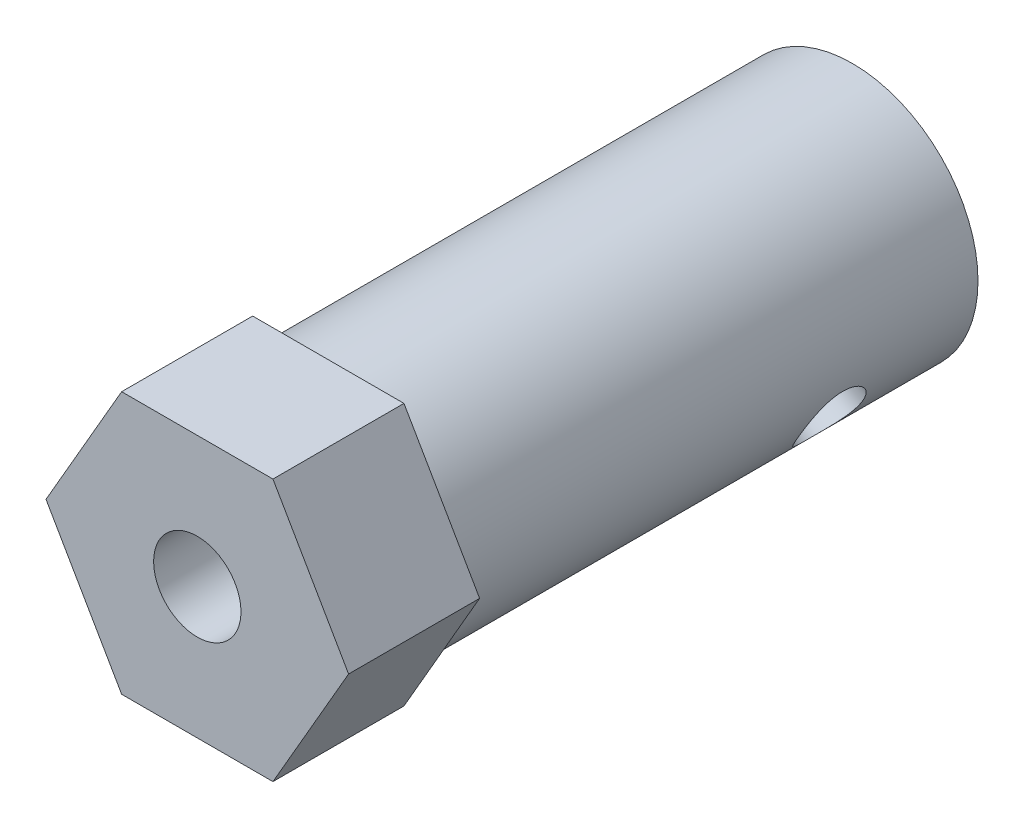
ISO-10303-21;
HEADER;
FILE_DESCRIPTION(('STEP AP214'),'2;1');
FILE_NAME('part.step','',(''),(''),'','','');
FILE_SCHEMA(('AUTOMOTIVE_DESIGN { 1 0 10303 214 1 1 1 1 }'));
ENDSEC;
DATA;
#1=APPLICATION_CONTEXT('core data for automotive mechanical design processes');
#2=APPLICATION_PROTOCOL_DEFINITION('international standard','automotive_design',2000,#1);
#3=PRODUCT_CONTEXT('',#1,'mechanical');
#4=PRODUCT('Part','Part','',(#3));
#5=PRODUCT_RELATED_PRODUCT_CATEGORY('part','',(#4));
#6=PRODUCT_DEFINITION_FORMATION('','',#4);
#7=PRODUCT_DEFINITION_CONTEXT('part definition',#1,'design');
#8=PRODUCT_DEFINITION('design','',#6,#7);
#9=PRODUCT_DEFINITION_SHAPE('','',#8);
#10=(LENGTH_UNIT() NAMED_UNIT(*) SI_UNIT(.MILLI.,.METRE.));
#11=(NAMED_UNIT(*) PLANE_ANGLE_UNIT() SI_UNIT($,.RADIAN.));
#12=(NAMED_UNIT(*) SI_UNIT($,.STERADIAN.) SOLID_ANGLE_UNIT());
#13=UNCERTAINTY_MEASURE_WITH_UNIT(LENGTH_MEASURE(1.E-05),#10,'distance_accuracy_value','');
#14=(GEOMETRIC_REPRESENTATION_CONTEXT(3) GLOBAL_UNCERTAINTY_ASSIGNED_CONTEXT((#13)) GLOBAL_UNIT_ASSIGNED_CONTEXT((#10,
#11,#12)) REPRESENTATION_CONTEXT('',''));
#15=CARTESIAN_POINT('',(0.,0.,0.));
#16=DIRECTION('',(0.,0.,1.));
#17=DIRECTION('',(1.,0.,0.));
#18=AXIS2_PLACEMENT_3D('',#15,#16,#17);
#19=CARTESIAN_POINT('',(-3.46410161513783,5.99999999999996,6.));
#20=DIRECTION('',(0.866025403784441,-0.499999999999995,0.));
#21=DIRECTION('',(0.499999999999995,0.866025403784442,0.));
#22=AXIS2_PLACEMENT_3D('',#19,#20,#21);
#23=PLANE('',#22);
#24=DIRECTION('',(-0.499999999999995,-0.866025403784441,0.));
#25=VECTOR('',#24,1.);
#26=CARTESIAN_POINT('',(-3.46410161513783,5.99999999999996,0.));
#27=LINE('',#26,#25);
#28=CARTESIAN_POINT('',(-3.46410161513783,5.99999999999996,0.));
#29=VERTEX_POINT('',#28);
#30=CARTESIAN_POINT('',(-6.92820323027551,0.,0.));
#31=VERTEX_POINT('',#30);
#32=EDGE_CURVE('E131',#29,#31,#27,.T.);
#33=ORIENTED_EDGE('',*,*,#32,.T.);
#34=DIRECTION('',(0.,0.,-1.));
#35=VECTOR('',#34,1.);
#36=CARTESIAN_POINT('',(-6.92820323027551,0.,6.));
#37=LINE('',#36,#35);
#38=CARTESIAN_POINT('',(-6.92820323027551,0.,6.));
#39=VERTEX_POINT('',#38);
#40=EDGE_CURVE('E54',#39,#31,#37,.T.);
#41=ORIENTED_EDGE('',*,*,#40,.F.);
#42=DIRECTION('',(-0.499999999999995,-0.866025403784441,0.));
#43=VECTOR('',#42,1.);
#44=CARTESIAN_POINT('',(-3.46410161513783,5.99999999999996,6.));
#45=LINE('',#44,#43);
#46=CARTESIAN_POINT('',(-3.46410161513783,5.99999999999996,6.));
#47=VERTEX_POINT('',#46);
#48=EDGE_CURVE('E145',#47,#39,#45,.T.);
#49=ORIENTED_EDGE('',*,*,#48,.F.);
#50=DIRECTION('',(0.,0.,-1.));
#51=VECTOR('',#50,1.);
#52=CARTESIAN_POINT('',(-3.46410161513783,5.99999999999996,6.));
#53=LINE('',#52,#51);
#54=EDGE_CURVE('E129',#47,#29,#53,.T.);
#55=ORIENTED_EDGE('',*,*,#54,.T.);
#56=EDGE_LOOP('',(#33,#41,#49,#55));
#57=FACE_BOUND('',#56,.T.);
#58=ADVANCED_FACE('F41',(#57),#23,.F.);
#59=CARTESIAN_POINT('',(-6.92820323027551,0.,6.));
#60=DIRECTION('',(0.866025403784438,0.500000000000001,0.));
#61=DIRECTION('',(-0.500000000000001,0.866025403784438,0.));
#62=AXIS2_PLACEMENT_3D('',#59,#60,#61);
#63=PLANE('',#62);
#64=DIRECTION('',(0.500000000000001,-0.866025403784438,0.));
#65=VECTOR('',#64,1.);
#66=CARTESIAN_POINT('',(-6.92820323027551,0.,0.));
#67=LINE('',#66,#65);
#68=CARTESIAN_POINT('',(-3.46410161513774,-6.00000000000001,0.));
#69=VERTEX_POINT('',#68);
#70=EDGE_CURVE('E138',#31,#69,#67,.T.);
#71=ORIENTED_EDGE('',*,*,#70,.T.);
#72=DIRECTION('',(0.,0.,-1.));
#73=VECTOR('',#72,1.);
#74=CARTESIAN_POINT('',(-3.46410161513774,-6.00000000000001,6.));
#75=LINE('',#74,#73);
#76=CARTESIAN_POINT('',(-3.46410161513774,-6.00000000000001,6.));
#77=VERTEX_POINT('',#76);
#78=EDGE_CURVE('E146',#77,#69,#75,.T.);
#79=ORIENTED_EDGE('',*,*,#78,.F.);
#80=DIRECTION('',(0.500000000000001,-0.866025403784438,0.));
#81=VECTOR('',#80,1.);
#82=CARTESIAN_POINT('',(-6.92820323027551,0.,6.));
#83=LINE('',#82,#81);
#84=EDGE_CURVE('E105',#39,#77,#83,.T.);
#85=ORIENTED_EDGE('',*,*,#84,.F.);
#86=ORIENTED_EDGE('',*,*,#40,.T.);
#87=EDGE_LOOP('',(#71,#79,#85,#86));
#88=FACE_BOUND('',#87,.T.);
#89=ADVANCED_FACE('F151',(#88),#63,.F.);
#90=CARTESIAN_POINT('',(-3.46410161513774,-6.00000000000001,6.));
#91=DIRECTION('',(0.,1.,0.));
#92=DIRECTION('',(-1.,0.,0.));
#93=AXIS2_PLACEMENT_3D('',#90,#91,#92);
#94=PLANE('',#93);
#95=DIRECTION('',(1.,0.,0.));
#96=VECTOR('',#95,1.);
#97=CARTESIAN_POINT('',(-3.46410161513774,-6.00000000000001,0.));
#98=LINE('',#97,#96);
#99=CARTESIAN_POINT('',(3.46410161513778,-5.99999999999999,0.));
#100=VERTEX_POINT('',#99);
#101=EDGE_CURVE('E140',#69,#100,#98,.T.);
#102=ORIENTED_EDGE('',*,*,#101,.T.);
#103=DIRECTION('',(0.,0.,-1.));
#104=VECTOR('',#103,1.);
#105=CARTESIAN_POINT('',(3.46410161513778,-5.99999999999999,6.));
#106=LINE('',#105,#104);
#107=CARTESIAN_POINT('',(3.46410161513778,-5.99999999999999,6.));
#108=VERTEX_POINT('',#107);
#109=EDGE_CURVE('E125',#108,#100,#106,.T.);
#110=ORIENTED_EDGE('',*,*,#109,.F.);
#111=DIRECTION('',(1.,0.,0.));
#112=VECTOR('',#111,1.);
#113=CARTESIAN_POINT('',(-3.46410161513774,-6.00000000000001,6.));
#114=LINE('',#113,#112);
#115=EDGE_CURVE('E113',#77,#108,#114,.T.);
#116=ORIENTED_EDGE('',*,*,#115,.F.);
#117=ORIENTED_EDGE('',*,*,#78,.T.);
#118=EDGE_LOOP('',(#102,#110,#116,#117));
#119=FACE_BOUND('',#118,.T.);
#120=ADVANCED_FACE('F157',(#119),#94,.F.);
#121=CARTESIAN_POINT('',(3.46410161513778,-5.99999999999999,6.));
#122=DIRECTION('',(-0.866025403784442,0.499999999999995,0.));
#123=DIRECTION('',(-0.499999999999995,-0.866025403784442,0.));
#124=AXIS2_PLACEMENT_3D('',#121,#122,#123);
#125=PLANE('',#124);
#126=DIRECTION('',(0.499999999999995,0.866025403784441,0.));
#127=VECTOR('',#126,1.);
#128=CARTESIAN_POINT('',(3.46410161513778,-5.99999999999999,0.));
#129=LINE('',#128,#127);
#130=CARTESIAN_POINT('',(6.92820323027551,0.,0.));
#131=VERTEX_POINT('',#130);
#132=EDGE_CURVE('E122',#100,#131,#129,.T.);
#133=ORIENTED_EDGE('',*,*,#132,.T.);
#134=DIRECTION('',(0.,0.,-1.));
#135=VECTOR('',#134,1.);
#136=CARTESIAN_POINT('',(6.92820323027551,0.,6.));
#137=LINE('',#136,#135);
#138=CARTESIAN_POINT('',(6.92820323027551,0.,6.));
#139=VERTEX_POINT('',#138);
#140=EDGE_CURVE('E117',#139,#131,#137,.T.);
#141=ORIENTED_EDGE('',*,*,#140,.F.);
#142=DIRECTION('',(0.499999999999995,0.866025403784441,0.));
#143=VECTOR('',#142,1.);
#144=CARTESIAN_POINT('',(3.46410161513778,-5.99999999999999,6.));
#145=LINE('',#144,#143);
#146=EDGE_CURVE('E108',#108,#139,#145,.T.);
#147=ORIENTED_EDGE('',*,*,#146,.F.);
#148=ORIENTED_EDGE('',*,*,#109,.T.);
#149=EDGE_LOOP('',(#133,#141,#147,#148));
#150=FACE_BOUND('',#149,.T.);
#151=ADVANCED_FACE('F123',(#150),#125,.F.);
#152=CARTESIAN_POINT('',(6.92820323027551,0.,6.));
#153=DIRECTION('',(-0.866025403784434,-0.500000000000007,0.));
#154=DIRECTION('',(0.500000000000007,-0.866025403784435,0.));
#155=AXIS2_PLACEMENT_3D('',#152,#153,#154);
#156=PLANE('',#155);
#157=DIRECTION('',(-0.500000000000007,0.866025403784434,0.));
#158=VECTOR('',#157,1.);
#159=CARTESIAN_POINT('',(6.92820323027551,0.,0.));
#160=LINE('',#159,#158);
#161=CARTESIAN_POINT('',(3.4641016151377,6.00000000000003,0.));
#162=VERTEX_POINT('',#161);
#163=EDGE_CURVE('E87',#131,#162,#160,.T.);
#164=ORIENTED_EDGE('',*,*,#163,.T.);
#165=DIRECTION('',(0.,0.,-1.));
#166=VECTOR('',#165,1.);
#167=CARTESIAN_POINT('',(3.4641016151377,6.00000000000003,6.));
#168=LINE('',#167,#166);
#169=CARTESIAN_POINT('',(3.4641016151377,6.00000000000003,6.));
#170=VERTEX_POINT('',#169);
#171=EDGE_CURVE('E121',#170,#162,#168,.T.);
#172=ORIENTED_EDGE('',*,*,#171,.F.);
#173=DIRECTION('',(-0.500000000000007,0.866025403784434,0.));
#174=VECTOR('',#173,1.);
#175=CARTESIAN_POINT('',(6.92820323027551,0.,6.));
#176=LINE('',#175,#174);
#177=EDGE_CURVE('E114',#139,#170,#176,.T.);
#178=ORIENTED_EDGE('',*,*,#177,.F.);
#179=ORIENTED_EDGE('',*,*,#140,.T.);
#180=EDGE_LOOP('',(#164,#172,#178,#179));
#181=FACE_BOUND('',#180,.T.);
#182=ADVANCED_FACE('F130',(#181),#156,.F.);
#183=CARTESIAN_POINT('',(3.4641016151377,6.00000000000003,6.));
#184=DIRECTION('',(0.,-1.,0.));
#185=DIRECTION('',(1.,0.,0.));
#186=AXIS2_PLACEMENT_3D('',#183,#184,#185);
#187=PLANE('',#186);
#188=DIRECTION('',(-1.,0.,0.));
#189=VECTOR('',#188,1.);
#190=CARTESIAN_POINT('',(3.4641016151377,6.00000000000003,0.));
#191=LINE('',#190,#189);
#192=EDGE_CURVE('E91',#162,#29,#191,.T.);
#193=ORIENTED_EDGE('',*,*,#192,.T.);
#194=ORIENTED_EDGE('',*,*,#54,.F.);
#195=DIRECTION('',(-1.,0.,0.));
#196=VECTOR('',#195,1.);
#197=CARTESIAN_POINT('',(3.4641016151377,6.00000000000003,6.));
#198=LINE('',#197,#196);
#199=EDGE_CURVE('E64',#170,#47,#198,.T.);
#200=ORIENTED_EDGE('',*,*,#199,.F.);
#201=ORIENTED_EDGE('',*,*,#171,.T.);
#202=EDGE_LOOP('',(#193,#194,#200,#201));
#203=FACE_BOUND('',#202,.T.);
#204=ADVANCED_FACE('F213',(#203),#187,.F.);
#205=CARTESIAN_POINT('',(0.,0.,6.));
#206=DIRECTION('',(0.,0.,1.));
#207=DIRECTION('',(1.,0.,0.));
#208=AXIS2_PLACEMENT_3D('',#205,#206,#207);
#209=PLANE('',#208);
#210=CARTESIAN_POINT('',(0.,0.,6.));
#211=DIRECTION('',(0.,0.,-1.));
#212=DIRECTION('',(-1.,0.,0.));
#213=AXIS2_PLACEMENT_3D('',#210,#211,#212);
#214=CIRCLE('',#213,2.);
#215=CARTESIAN_POINT('',(-2.,0.,6.));
#216=VERTEX_POINT('',#215);
#217=EDGE_CURVE('E164',#216,#216,#214,.T.);
#218=ORIENTED_EDGE('',*,*,#217,.T.);
#219=EDGE_LOOP('',(#218));
#220=FACE_BOUND('',#219,.T.);
#221=ORIENTED_EDGE('',*,*,#48,.T.);
#222=ORIENTED_EDGE('',*,*,#84,.T.);
#223=ORIENTED_EDGE('',*,*,#115,.T.);
#224=ORIENTED_EDGE('',*,*,#146,.T.);
#225=ORIENTED_EDGE('',*,*,#177,.T.);
#226=ORIENTED_EDGE('',*,*,#199,.T.);
#227=EDGE_LOOP('',(#221,#222,#223,#224,#225,#226));
#228=FACE_BOUND('',#227,.T.);
#229=ADVANCED_FACE('F112',(#220,#228),#209,.T.);
#230=CARTESIAN_POINT('',(0.,0.,0.));
#231=DIRECTION('',(0.,0.,1.));
#232=DIRECTION('',(1.,0.,0.));
#233=AXIS2_PLACEMENT_3D('',#230,#231,#232);
#234=PLANE('',#233);
#235=CARTESIAN_POINT('',(0.,0.,0.));
#236=DIRECTION('',(0.,0.,-1.));
#237=DIRECTION('',(-1.,0.,0.));
#238=AXIS2_PLACEMENT_3D('',#235,#236,#237);
#239=CIRCLE('',#238,5.75);
#240=CARTESIAN_POINT('',(-5.75,0.,0.));
#241=VERTEX_POINT('',#240);
#242=EDGE_CURVE('E11',#241,#241,#239,.T.);
#243=ORIENTED_EDGE('',*,*,#242,.F.);
#244=EDGE_LOOP('',(#243));
#245=FACE_BOUND('',#244,.T.);
#246=ORIENTED_EDGE('',*,*,#32,.F.);
#247=ORIENTED_EDGE('',*,*,#192,.F.);
#248=ORIENTED_EDGE('',*,*,#163,.F.);
#249=ORIENTED_EDGE('',*,*,#132,.F.);
#250=ORIENTED_EDGE('',*,*,#101,.F.);
#251=ORIENTED_EDGE('',*,*,#70,.F.);
#252=EDGE_LOOP('',(#246,#247,#248,#249,#250,#251));
#253=FACE_BOUND('',#252,.T.);
#254=ADVANCED_FACE('F156',(#245,#253),#234,.F.);
#255=CARTESIAN_POINT('',(0.,0.,-24.));
#256=DIRECTION('',(0.,0.,1.));
#257=DIRECTION('',(1.,0.,0.));
#258=AXIS2_PLACEMENT_3D('',#255,#256,#257);
#259=CYLINDRICAL_SURFACE('',#258,5.75);
#260=CARTESIAN_POINT('',(5.55722113075736,-1.47641230822012,-18.));
#261=CARTESIAN_POINT('',(5.55722136071016,-1.47641489598219,-18.0827025118796));
#262=CARTESIAN_POINT('',(5.55540776706454,-1.48329007948835,-18.1654278772811));
#263=CARTESIAN_POINT('',(5.54807553473378,-1.51047987820257,-18.328494285914));
#264=CARTESIAN_POINT('',(5.54255493246361,-1.53080161590377,-18.4088340419363));
#265=CARTESIAN_POINT('',(5.52760134616089,-1.58394395701895,-18.5647468235353));
#266=CARTESIAN_POINT('',(5.51817370147193,-1.61674749787789,-18.6403261928731));
#267=CARTESIAN_POINT('',(5.49509515344553,-1.69352577324471,-18.7848659142589));
#268=CARTESIAN_POINT('',(5.48144397417512,-1.73750123760575,-18.8538258334577));
#269=CARTESIAN_POINT('',(5.44922524142547,-1.83607840051586,-18.9848203400384));
#270=CARTESIAN_POINT('',(5.43055778730774,-1.89088926191198,-19.0466729921918));
#271=CARTESIAN_POINT('',(5.38812936910053,-2.0085989367878,-19.1600908276964));
#272=CARTESIAN_POINT('',(5.36436789625488,-2.07149855786688,-19.2116549825083));
#273=CARTESIAN_POINT('',(5.31117832236998,-2.20433046836102,-19.3037856975123));
#274=CARTESIAN_POINT('',(5.28166917074583,-2.27435554396496,-19.3441721440468));
#275=CARTESIAN_POINT('',(5.21734054730939,-2.41827644085031,-19.4116276367408));
#276=CARTESIAN_POINT('',(5.18252193222295,-2.49217163639514,-19.4386988284544));
#277=CARTESIAN_POINT('',(5.10890534133279,-2.63974107934647,-19.4781686910732));
#278=CARTESIAN_POINT('',(5.07021160293842,-2.71338451067179,-19.4908766617071));
#279=CARTESIAN_POINT('',(4.98914035484316,-2.8597150031523,-19.5022316687055));
#280=CARTESIAN_POINT('',(4.94676343726796,-2.93240221587847,-19.5008809610801));
#281=CARTESIAN_POINT('',(4.86067756766856,-3.07293746674693,-19.4843764114755));
#282=CARTESIAN_POINT('',(4.81702548141221,-3.14085997104418,-19.4695566289211));
#283=CARTESIAN_POINT('',(4.72892558823583,-3.27200352174088,-19.4270733267933));
#284=CARTESIAN_POINT('',(4.68447773708927,-3.33522430581835,-19.3994090912151));
#285=CARTESIAN_POINT('',(4.59600500303769,-3.45614085391043,-19.3317611105538));
#286=CARTESIAN_POINT('',(4.55198830983483,-3.51377757775231,-19.2916613442095));
#287=CARTESIAN_POINT('',(4.46656720195115,-3.62174318001789,-19.2003692607206));
#288=CARTESIAN_POINT('',(4.42516327919811,-3.67207068458241,-19.1491748626962));
#289=CARTESIAN_POINT('',(4.34556760565659,-3.7659588427232,-19.0353671462552));
#290=CARTESIAN_POINT('',(4.30750615214473,-3.80927692660276,-18.9724622554754));
#291=CARTESIAN_POINT('',(4.23785578042895,-3.8866173972475,-18.8379452148636));
#292=CARTESIAN_POINT('',(4.20626722266665,-3.92063926639042,-18.7663325804967));
#293=CARTESIAN_POINT('',(4.1510923893375,-3.97901518520282,-18.6158563577676));
#294=CARTESIAN_POINT('',(4.12755259364875,-4.00331321465999,-18.5369538883825));
#295=CARTESIAN_POINT('',(4.090138880542,-4.04153276606443,-18.3744844829647));
#296=CARTESIAN_POINT('',(4.0762626840089,-4.05545673474001,-18.2909186517895));
#297=CARTESIAN_POINT('',(4.05931325975991,-4.07242147034947,-18.1240609452585));
#298=CARTESIAN_POINT('',(4.0559418618996,-4.07576266731435,-18.0408298385871));
#299=CARTESIAN_POINT('',(4.05937152111611,-4.07234685151389,-17.874791704668));
#300=CARTESIAN_POINT('',(4.06617154812631,-4.06559086129712,-17.7919846353299));
#301=CARTESIAN_POINT('',(4.08929757745671,-4.04232648260581,-17.6307016559855));
#302=CARTESIAN_POINT('',(4.10544809988444,-4.02599767699227,-17.5521743674906));
#303=CARTESIAN_POINT('',(4.14620349249303,-3.98401143692444,-17.3999598290562));
#304=CARTESIAN_POINT('',(4.1708094311122,-3.95835282351865,-17.3262731921906));
#305=CARTESIAN_POINT('',(4.22777189799078,-3.89746235669493,-17.1841116303205));
#306=CARTESIAN_POINT('',(4.2602813513885,-3.86203949812469,-17.1157799033486));
#307=CARTESIAN_POINT('',(4.3311384002766,-3.78240336253314,-16.9878114474233));
#308=CARTESIAN_POINT('',(4.36948704402818,-3.73818850672095,-16.9281762834622));
#309=CARTESIAN_POINT('',(4.45138754174426,-3.64030552024394,-16.8176094483759));
#310=CARTESIAN_POINT('',(4.49505352262524,-3.5864107716838,-16.7669623765694));
#311=CARTESIAN_POINT('',(4.58474574264704,-3.47101406352671,-16.6778887151307));
#312=CARTESIAN_POINT('',(4.63077185645956,-3.40951250762377,-16.639461477377));
#313=CARTESIAN_POINT('',(4.72289476696002,-3.28069833721807,-16.5762649912451));
#314=CARTESIAN_POINT('',(4.76898840829988,-3.21343308512531,-16.5513948481437));
#315=CARTESIAN_POINT('',(4.85978523879196,-3.07438991312508,-16.5157219058226));
#316=CARTESIAN_POINT('',(4.90448871991868,-3.00261295050913,-16.5049161329262));
#317=CARTESIAN_POINT('',(4.98966950541398,-2.85875540689107,-16.4978582656111));
#318=CARTESIAN_POINT('',(5.0302323975609,-2.78674573137666,-16.5011878239951));
#319=CARTESIAN_POINT('',(5.10746567709305,-2.64253393975375,-16.5213394073171));
#320=CARTESIAN_POINT('',(5.14413619951267,-2.57033183041033,-16.5381609640163));
#321=CARTESIAN_POINT('',(5.21263698300613,-2.42839294863188,-16.5845866777533));
#322=CARTESIAN_POINT('',(5.24449642665121,-2.35864345904263,-16.6141092081108));
#323=CARTESIAN_POINT('',(5.30331713657454,-2.22323705430391,-16.6850256400347));
#324=CARTESIAN_POINT('',(5.33027773862,-2.15758069493265,-16.7264211494965));
#325=CARTESIAN_POINT('',(5.37989987925112,-2.03074816512123,-16.8211511060026));
#326=CARTESIAN_POINT('',(5.40243300755437,-1.96973066277838,-16.8747652445582));
#327=CARTESIAN_POINT('',(5.44252151759536,-1.85609752882473,-16.9918756389475));
#328=CARTESIAN_POINT('',(5.46007560580036,-1.80348408209869,-17.0553744561532));
#329=CARTESIAN_POINT('',(5.49085193822908,-1.70752535479361,-17.1920402595224));
#330=CARTESIAN_POINT('',(5.50397654142989,-1.66439548816295,-17.2653807938219));
#331=CARTESIAN_POINT('',(5.525759730213,-1.59058804468881,-17.4186604878402));
#332=CARTESIAN_POINT('',(5.53442135588035,-1.55990199442577,-17.4985951126335));
#333=CARTESIAN_POINT('',(5.54647206684565,-1.51643034957237,-17.6485762864125));
#334=CARTESIAN_POINT('',(5.55051320500374,-1.50146914084626,-17.7179478254287));
#335=CARTESIAN_POINT('',(5.55588749873707,-1.48145952205819,-17.8582074149736));
#336=CARTESIAN_POINT('',(5.55722093360818,-1.47641008961192,-17.9290953083301));
#337=CARTESIAN_POINT('',(5.55722113075736,-1.47641230822012,-18.));
#338=B_SPLINE_CURVE_WITH_KNOTS('',3,(#260,#261,#262,#263,#264,#265,#266,#267,#268,#269,#270,
#271,#272,#273,#274,#275,#276,#277,#278,#279,#280,#281,#282,#283,#284,#285,#286,#287,#288,#289,
#290,#291,#292,#293,#294,#295,#296,#297,#298,#299,#300,#301,#302,#303,#304,#305,#306,#307,#308,
#309,#310,#311,#312,#313,#314,#315,#316,#317,#318,#319,#320,#321,#322,#323,#324,#325,#326,#327,
#328,#329,#330,#331,#332,#333,#334,#335,#336,#337),.UNSPECIFIED.,.T.,.F.,(4,2,2,2,2,2,2,2,2,2,2,
2,2,2,2,2,2,2,2,2,2,2,2,2,2,2,2,2,2,2,2,2,2,2,2,2,2,2,4),(0.,0.24784693221347,0.495825251450722,
0.743465796519596,0.991122523916575,1.24413298994995,1.49716873674028,1.75407149955016,
2.01093285275295,2.26215074877579,2.51332833223609,2.75844131790607,3.00356796886319,
3.25105414713942,3.49858678350027,3.75340001453818,4.00822743093465,4.26450250455337,
4.52071711639577,4.76958977198248,5.01843722578486,5.26275935549397,5.50711236945145,
5.75663370302619,6.00619988401493,6.26263234557327,6.51905120407022,6.77353474031641,
7.02796446151303,7.27491743805458,7.52186184448271,7.76724235555625,8.01265611292846,
8.26438206043911,8.51617334546957,8.77319910700255,9.03004955584013,9.24256212496342,
9.45505277259351),.UNSPECIFIED.);
#339=CARTESIAN_POINT('',(5.55722113075736,-1.47641230822012,-18.));
#340=VERTEX_POINT('',#339);
#341=EDGE_CURVE('E166',#340,#340,#338,.T.);
#342=ORIENTED_EDGE('',*,*,#341,.T.);
#343=EDGE_LOOP('',(#342));
#344=FACE_BOUND('',#343,.T.);
#345=CARTESIAN_POINT('',(0.,0.,-24.));
#346=DIRECTION('',(0.,0.,-1.));
#347=DIRECTION('',(-1.,0.,0.));
#348=AXIS2_PLACEMENT_3D('',#345,#346,#347);
#349=CIRCLE('',#348,5.75);
#350=CARTESIAN_POINT('',(-5.75,0.,-24.));
#351=VERTEX_POINT('',#350);
#352=EDGE_CURVE('E139',#351,#351,#349,.T.);
#353=ORIENTED_EDGE('',*,*,#352,.F.);
#354=EDGE_LOOP('',(#353));
#355=FACE_BOUND('',#354,.T.);
#356=ORIENTED_EDGE('',*,*,#242,.T.);
#357=EDGE_LOOP('',(#356));
#358=FACE_BOUND('',#357,.T.);
#359=ADVANCED_FACE('F179',(#344,#355,#358),#259,.T.);
#360=CARTESIAN_POINT('',(0.,0.,-24.));
#361=DIRECTION('',(0.,0.,-1.));
#362=DIRECTION('',(-1.,0.,0.));
#363=AXIS2_PLACEMENT_3D('',#360,#361,#362);
#364=PLANE('',#363);
#365=CARTESIAN_POINT('',(0.,0.,-24.));
#366=DIRECTION('',(0.,0.,-1.));
#367=DIRECTION('',(-1.,0.,0.));
#368=AXIS2_PLACEMENT_3D('',#365,#366,#367);
#369=CIRCLE('',#368,2.);
#370=CARTESIAN_POINT('',(-2.,0.,-24.));
#371=VERTEX_POINT('',#370);
#372=EDGE_CURVE('E167',#371,#371,#369,.T.);
#373=ORIENTED_EDGE('',*,*,#372,.F.);
#374=EDGE_LOOP('',(#373));
#375=FACE_BOUND('',#374,.T.);
#376=ORIENTED_EDGE('',*,*,#352,.T.);
#377=EDGE_LOOP('',(#376));
#378=FACE_BOUND('',#377,.T.);
#379=ADVANCED_FACE('F189',(#375,#378),#364,.T.);
#380=CARTESIAN_POINT('',(0.,0.,6.));
#381=DIRECTION('',(0.,0.,-1.));
#382=DIRECTION('',(-1.,0.,0.));
#383=AXIS2_PLACEMENT_3D('',#380,#381,#382);
#384=CYLINDRICAL_SURFACE('',#383,2.);
#385=CARTESIAN_POINT('',(1.89564392373896,0.637600277910523,-18.));
#386=CARTESIAN_POINT('',(1.89565408748977,0.637585392226019,-17.9300025765744));
#387=CARTESIAN_POINT('',(1.89809043080659,0.630461731209005,-17.8599541656881));
#388=CARTESIAN_POINT('',(1.90694493610832,0.603112635919793,-17.7226701437905));
#389=CARTESIAN_POINT('',(1.91337496438087,0.582848148864565,-17.6554435549805));
#390=CARTESIAN_POINT('',(1.92810346331423,0.532070602372365,-17.5264201532616));
#391=CARTESIAN_POINT('',(1.9363749313233,0.501702798658394,-17.4645612232375));
#392=CARTESIAN_POINT('',(1.9529234442087,0.432833528036545,-17.3456545455548));
#393=CARTESIAN_POINT('',(1.96120048829051,0.39433304424943,-17.2886062175308));
#394=CARTESIAN_POINT('',(1.97773475424673,0.301990819027161,-17.1678872036834));
#395=CARTESIAN_POINT('',(1.98562473025925,0.246624837378537,-17.1053320657735));
#396=CARTESIAN_POINT('',(1.99678356754875,0.128107308785521,-16.9874745337577));
#397=CARTESIAN_POINT('',(2.000045557029,0.0649443354291098,-16.9321830351797));
#398=CARTESIAN_POINT('',(1.99994409142852,-0.0812468700736253,-16.8191412613445));
#399=CARTESIAN_POINT('',(1.99509185976308,-0.16569795771843,-16.7631940332801));
#400=CARTESIAN_POINT('',(1.97270771920409,-0.340826196887823,-16.6653777917172));
#401=CARTESIAN_POINT('',(1.95520591099417,-0.431488106501221,-16.6234757025312));
#402=CARTESIAN_POINT('',(1.91298074093011,-0.587305342613247,-16.5667923140971));
#403=CARTESIAN_POINT('',(1.89202742708328,-0.65190658539806,-16.5476429040215));
#404=CARTESIAN_POINT('',(1.84275156522514,-0.78037338205408,-16.5186098840033));
#405=CARTESIAN_POINT('',(1.81443544704665,-0.844239527308518,-16.5087182238933));
#406=CARTESIAN_POINT('',(1.75077468959898,-0.969396796570662,-16.4987782661375));
#407=CARTESIAN_POINT('',(1.71541202495333,-1.03068081801613,-16.4987555456236));
#408=CARTESIAN_POINT('',(1.63879999349243,-1.14859927788888,-16.5086179367803));
#409=CARTESIAN_POINT('',(1.59754926533105,-1.20523263627904,-16.5185053429081));
#410=CARTESIAN_POINT('',(1.51222065234838,-1.31058455676589,-16.5470810505899));
#411=CARTESIAN_POINT('',(1.46828798526321,-1.35950776469479,-16.5654563263871));
#412=CARTESIAN_POINT('',(1.37790903600702,-1.45103711456792,-16.6099956421822));
#413=CARTESIAN_POINT('',(1.33146220755323,-1.49364187604387,-16.6361613805132));
#414=CARTESIAN_POINT('',(1.23239733682158,-1.57664611720255,-16.6985296151453));
#415=CARTESIAN_POINT('',(1.17965563227528,-1.61630732162638,-16.7355120966188));
#416=CARTESIAN_POINT('',(1.07457113996937,-1.68800223890063,-16.8167337039705));
#417=CARTESIAN_POINT('',(1.02222873227807,-1.72002939434674,-16.8609790136999));
#418=CARTESIAN_POINT('',(0.909461642408373,-1.78264154526087,-16.9652233488209));
#419=CARTESIAN_POINT('',(0.849472575511648,-1.81170345690481,-17.0266092100264));
#420=CARTESIAN_POINT('',(0.73528223528092,-1.86097297626604,-17.1578345836219));
#421=CARTESIAN_POINT('',(0.681083725991977,-1.88117636964406,-17.2276780995251));
#422=CARTESIAN_POINT('',(0.592127494785225,-1.91079361445672,-17.3609818702456));
#423=CARTESIAN_POINT('',(0.555643511488165,-1.92154920300619,-17.4229870453006));
#424=CARTESIAN_POINT('',(0.491826641358085,-1.93886609379974,-17.5520652814194));
#425=CARTESIAN_POINT('',(0.464473103722223,-1.94543689201414,-17.6191264796904));
#426=CARTESIAN_POINT('',(0.4265051152861,-1.95407248304111,-17.7436869439983));
#427=CARTESIAN_POINT('',(0.413647540168983,-1.95677223513885,-17.8004470821169));
#428=CARTESIAN_POINT('',(0.397567036428443,-1.96010546225804,-17.9153554661738));
#429=CARTESIAN_POINT('',(0.394331781273285,-1.96074158096169,-17.9735018399028));
#430=CARTESIAN_POINT('',(0.397935743729606,-1.96001244952257,-18.0894789917334));
#431=CARTESIAN_POINT('',(0.404778669514205,-1.95864646272456,-18.1473096458097));
#432=CARTESIAN_POINT('',(0.427607342520073,-1.95378673256666,-18.2610761524429));
#433=CARTESIAN_POINT('',(0.443608694536478,-1.95028935693044,-18.3170085979481));
#434=CARTESIAN_POINT('',(0.490410008887602,-1.93914011382242,-18.4463380449389));
#435=CARTESIAN_POINT('',(0.524507283729583,-1.93042320958673,-18.518435953915));
#436=CARTESIAN_POINT('',(0.602270967960614,-1.90759330516805,-18.6563076636401));
#437=CARTESIAN_POINT('',(0.645954964609417,-1.89347035143975,-18.7220695172947));
#438=CARTESIAN_POINT('',(0.741248766239042,-1.85828512333923,-18.8493490080481));
#439=CARTESIAN_POINT('',(0.793085005232819,-1.83699415313665,-18.9106328762182));
#440=CARTESIAN_POINT('',(0.900859102345447,-1.78661638972402,-19.0260020963612));
#441=CARTESIAN_POINT('',(0.956798945733176,-1.75752580485511,-19.0800839279889));
#442=CARTESIAN_POINT('',(1.08306347963633,-1.68328347791819,-19.1912769916294));
#443=CARTESIAN_POINT('',(1.1538640186322,-1.63601237801057,-19.2464752388576));
#444=CARTESIAN_POINT('',(1.29427595520156,-1.52731038197266,-19.3426207334509));
#445=CARTESIAN_POINT('',(1.36388961107557,-1.46591061874742,-19.3835988245813));
#446=CARTESIAN_POINT('',(1.47700387262091,-1.35014237769219,-19.4384379914469));
#447=CARTESIAN_POINT('',(1.52200059949121,-1.29932719312372,-19.4567567932754));
#448=CARTESIAN_POINT('',(1.60756517285095,-1.19182075592638,-19.4841287963075));
#449=CARTESIAN_POINT('',(1.64813694996999,-1.13513480695957,-19.4931902815485));
#450=CARTESIAN_POINT('',(1.72346052121869,-1.01715014675135,-19.5015163909286));
#451=CARTESIAN_POINT('',(1.75819846011135,-0.955840941675915,-19.5007580173482));
#452=CARTESIAN_POINT('',(1.8207033481814,-0.830625360315254,-19.4894390086988));
#453=CARTESIAN_POINT('',(1.84846843777298,-0.766718296476749,-19.4788757622925));
#454=CARTESIAN_POINT('',(1.89593226272871,-0.640217011748749,-19.4490250838328));
#455=CARTESIAN_POINT('',(1.91584176676155,-0.577638536564044,-19.4299998186784));
#456=CARTESIAN_POINT('',(1.94894647050619,-0.45358010335396,-19.3842119343811));
#457=CARTESIAN_POINT('',(1.96214023231773,-0.392100383298415,-19.3574476601691));
#458=CARTESIAN_POINT('',(1.98357363241055,-0.264702532323772,-19.293722062404));
#459=CARTESIAN_POINT('',(1.99108276584025,-0.199070541641537,-19.2559490686404));
#460=CARTESIAN_POINT('',(1.9997147986867,-0.0721024895415994,-19.1731335594458));
#461=CARTESIAN_POINT('',(2.00083179391228,-0.0107704514578929,-19.128084362714));
#462=CARTESIAN_POINT('',(1.99774537198576,0.118069424022798,-19.0219946334392));
#463=CARTESIAN_POINT('',(1.99244573883613,0.184398800894352,-18.9595536005601));
#464=CARTESIAN_POINT('',(1.97721613716281,0.307317157844424,-18.8261319281001));
#465=CARTESIAN_POINT('',(1.96728447604931,0.363902567021096,-18.7551481739634));
#466=CARTESIAN_POINT('',(1.948306507184,0.453573830174071,-18.6211167494097));
#467=CARTESIAN_POINT('',(1.93953208214806,0.489095609037574,-18.5596650172934));
#468=CARTESIAN_POINT('',(1.92308431955569,0.550228455684845,-18.4319170869441));
#469=CARTESIAN_POINT('',(1.91540809509365,0.575865819937025,-18.3656343084046));
#470=CARTESIAN_POINT('',(1.90507025160778,0.609030000107484,-18.2492117804031));
#471=CARTESIAN_POINT('',(1.901598338128,0.619662331912667,-18.2000329287095));
#472=CARTESIAN_POINT('',(1.89688225311123,0.633950530515307,-18.1005776669663));
#473=CARTESIAN_POINT('',(1.89563661979891,0.637610975156954,-18.0503019990563));
#474=CARTESIAN_POINT('',(1.89564392373896,0.637600277910523,-18.));
#475=B_SPLINE_CURVE_WITH_KNOTS('',3,(#385,#386,#387,#388,#389,#390,#391,#392,#393,#394,#395,
#396,#397,#398,#399,#400,#401,#402,#403,#404,#405,#406,#407,#408,#409,#410,#411,#412,#413,#414,
#415,#416,#417,#418,#419,#420,#421,#422,#423,#424,#425,#426,#427,#428,#429,#430,#431,#432,#433,
#434,#435,#436,#437,#438,#439,#440,#441,#442,#443,#444,#445,#446,#447,#448,#449,#450,#451,#452,
#453,#454,#455,#456,#457,#458,#459,#460,#461,#462,#463,#464,#465,#466,#467,#468,#469,#470,#471,
#472,#473,#474),.UNSPECIFIED.,.T.,.F.,(4,2,2,2,2,2,2,2,2,2,2,2,2,2,2,2,2,2,2,2,2,2,2,2,2,2,2,2,
2,2,2,2,2,2,2,2,2,2,2,2,2,2,2,2,4),(0.,0.209731776684494,0.420089722582993,0.627545385620143,
0.834975984672346,1.08585208691169,1.33710031031849,1.63964848103538,1.94147907444963,
2.15227725277555,2.36289195870711,2.57405250727806,2.78526195641288,2.9892375589505,
3.19325766108669,3.41936844116894,3.64567274887663,3.91649517204701,4.18744629647933,
4.40499409477197,4.62204646613006,4.79608005545902,4.96989060538193,5.14376512326213,
5.31793678696019,5.55730028202398,5.79710662639151,6.0454320909006,6.29387849446618,
6.59652499511463,6.89851088586565,7.10852896194427,7.31835893539181,7.52868041101044,
7.73905791773945,7.94332812691912,8.14764205379333,8.37510052489611,8.60276905744645,
8.87547580578155,9.14828228208531,9.36218279640836,9.575510257727,9.72632812073767,
9.8770469203241),.UNSPECIFIED.);
#476=CARTESIAN_POINT('',(1.89564392373896,0.637600277910523,-18.));
#477=VERTEX_POINT('',#476);
#478=EDGE_CURVE('E42',#477,#477,#475,.T.);
#479=ORIENTED_EDGE('',*,*,#478,.T.);
#480=EDGE_LOOP('',(#479));
#481=FACE_BOUND('',#480,.T.);
#482=ORIENTED_EDGE('',*,*,#217,.F.);
#483=EDGE_LOOP('',(#482));
#484=FACE_BOUND('',#483,.T.);
#485=ORIENTED_EDGE('',*,*,#372,.T.);
#486=EDGE_LOOP('',(#485));
#487=FACE_BOUND('',#486,.T.);
#488=ADVANCED_FACE('F184',(#481,#484,#487),#384,.F.);
#489=CARTESIAN_POINT('',(0.,0.,-18.));
#490=DIRECTION('',(0.866025403784441,-0.499999999999995,0.));
#491=DIRECTION('',(0.499999999999995,0.866025403784441,0.));
#492=AXIS2_PLACEMENT_3D('',#489,#490,#491);
#493=CYLINDRICAL_SURFACE('',#492,1.5);
#494=ORIENTED_EDGE('',*,*,#478,.F.);
#495=EDGE_LOOP('',(#494));
#496=FACE_BOUND('',#495,.T.);
#497=ORIENTED_EDGE('',*,*,#341,.F.);
#498=EDGE_LOOP('',(#497));
#499=FACE_BOUND('',#498,.T.);
#500=ADVANCED_FACE('F182',(#496,#499),#493,.F.);
#501=CLOSED_SHELL('',(#58,#89,#120,#151,#182,#204,#229,#254,#359,#379,#488,#500));
#502=MANIFOLD_SOLID_BREP('B2',#501);
#503=ADVANCED_BREP_SHAPE_REPRESENTATION('',(#18,#502),#14);
#504=SHAPE_DEFINITION_REPRESENTATION(#9,#503);
ENDSEC;
END-ISO-10303-21;
